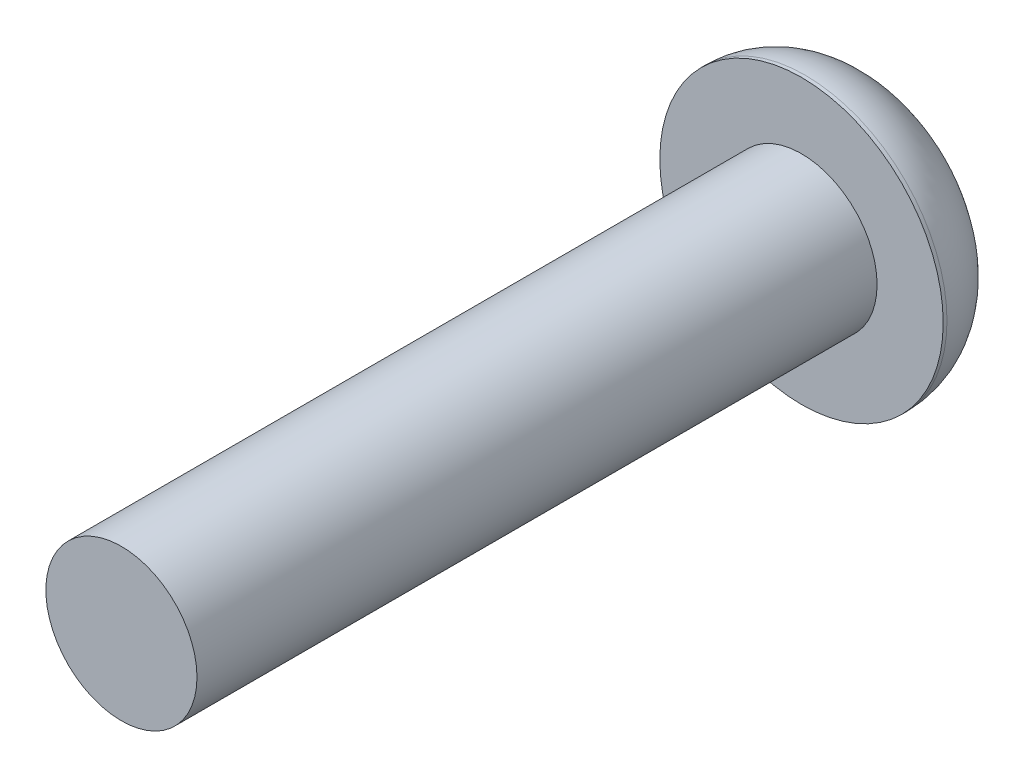
ISO-10303-21;
HEADER;
FILE_DESCRIPTION(('STEP AP214'),'2;1');
FILE_NAME('part.step','',(''),(''),'','','');
FILE_SCHEMA(('AUTOMOTIVE_DESIGN { 1 0 10303 214 1 1 1 1 }'));
ENDSEC;
DATA;
#1=APPLICATION_CONTEXT('core data for automotive mechanical design processes');
#2=APPLICATION_PROTOCOL_DEFINITION('international standard','automotive_design',2000,#1);
#3=PRODUCT_CONTEXT('',#1,'mechanical');
#4=PRODUCT('Part','Part','',(#3));
#5=PRODUCT_RELATED_PRODUCT_CATEGORY('part','',(#4));
#6=PRODUCT_DEFINITION_FORMATION('','',#4);
#7=PRODUCT_DEFINITION_CONTEXT('part definition',#1,'design');
#8=PRODUCT_DEFINITION('design','',#6,#7);
#9=PRODUCT_DEFINITION_SHAPE('','',#8);
#10=(LENGTH_UNIT() NAMED_UNIT(*) SI_UNIT(.MILLI.,.METRE.));
#11=(NAMED_UNIT(*) PLANE_ANGLE_UNIT() SI_UNIT($,.RADIAN.));
#12=(NAMED_UNIT(*) SI_UNIT($,.STERADIAN.) SOLID_ANGLE_UNIT());
#13=UNCERTAINTY_MEASURE_WITH_UNIT(LENGTH_MEASURE(1.E-05),#10,'distance_accuracy_value','');
#14=(GEOMETRIC_REPRESENTATION_CONTEXT(3) GLOBAL_UNCERTAINTY_ASSIGNED_CONTEXT((#13)) GLOBAL_UNIT_ASSIGNED_CONTEXT((#10,
#11,#12)) REPRESENTATION_CONTEXT('',''));
#15=CARTESIAN_POINT('',(0.,0.,0.));
#16=DIRECTION('',(0.,0.,1.));
#17=DIRECTION('',(1.,0.,0.));
#18=AXIS2_PLACEMENT_3D('',#15,#16,#17);
#19=CARTESIAN_POINT('',(0.,0.,18.));
#20=DIRECTION('',(0.,0.,-1.));
#21=DIRECTION('',(-1.,0.,0.));
#22=AXIS2_PLACEMENT_3D('',#19,#20,#21);
#23=CYLINDRICAL_SURFACE('',#22,2.);
#24=CARTESIAN_POINT('',(0.,0.,18.));
#25=DIRECTION('',(0.,0.,1.));
#26=DIRECTION('',(1.,0.,0.));
#27=AXIS2_PLACEMENT_3D('',#24,#25,#26);
#28=CIRCLE('',#27,2.);
#29=CARTESIAN_POINT('',(2.,0.,18.));
#30=VERTEX_POINT('',#29);
#31=EDGE_CURVE('E50',#30,#30,#28,.T.);
#32=ORIENTED_EDGE('',*,*,#31,.F.);
#33=EDGE_LOOP('',(#32));
#34=FACE_BOUND('',#33,.T.);
#35=CARTESIAN_POINT('',(0.,0.,0.));
#36=DIRECTION('',(0.,0.,1.));
#37=DIRECTION('',(1.,0.,0.));
#38=AXIS2_PLACEMENT_3D('',#35,#36,#37);
#39=CIRCLE('',#38,2.);
#40=CARTESIAN_POINT('',(2.,0.,0.));
#41=VERTEX_POINT('',#40);
#42=EDGE_CURVE('E55',#41,#41,#39,.T.);
#43=ORIENTED_EDGE('',*,*,#42,.T.);
#44=EDGE_LOOP('',(#43));
#45=FACE_BOUND('',#44,.T.);
#46=ADVANCED_FACE('F37',(#34,#45),#23,.T.);
#47=CARTESIAN_POINT('',(0.,0.,18.));
#48=DIRECTION('',(0.,0.,1.));
#49=DIRECTION('',(1.,0.,0.));
#50=AXIS2_PLACEMENT_3D('',#47,#48,#49);
#51=PLANE('',#50);
#52=ORIENTED_EDGE('',*,*,#31,.T.);
#53=EDGE_LOOP('',(#52));
#54=FACE_BOUND('',#53,.T.);
#55=ADVANCED_FACE('F82',(#54),#51,.T.);
#56=CARTESIAN_POINT('',(0.,0.,-2.1));
#57=DIRECTION('',(0.,0.,1.));
#58=DIRECTION('',(1.,0.,0.));
#59=AXIS2_PLACEMENT_3D('',#56,#57,#58);
#60=CYLINDRICAL_SURFACE('',#59,3.75);
#61=CARTESIAN_POINT('',(0.,0.,-0.1));
#62=DIRECTION('',(0.,0.,-1.));
#63=DIRECTION('',(-1.,0.,0.));
#64=AXIS2_PLACEMENT_3D('',#61,#62,#63);
#65=CIRCLE('',#64,3.75);
#66=CARTESIAN_POINT('',(-3.75,0.,-0.1));
#67=VERTEX_POINT('',#66);
#68=EDGE_CURVE('E10',#67,#67,#65,.F.);
#69=ORIENTED_EDGE('',*,*,#68,.T.);
#70=EDGE_LOOP('',(#69));
#71=FACE_BOUND('',#70,.T.);
#72=CARTESIAN_POINT('',(0.,0.,0.));
#73=DIRECTION('',(0.,0.,-1.));
#74=DIRECTION('',(-1.,0.,0.));
#75=AXIS2_PLACEMENT_3D('',#72,#73,#74);
#76=CIRCLE('',#75,3.75);
#77=CARTESIAN_POINT('',(-3.75,0.,0.));
#78=VERTEX_POINT('',#77);
#79=EDGE_CURVE('E60',#78,#78,#76,.T.);
#80=ORIENTED_EDGE('',*,*,#79,.T.);
#81=EDGE_LOOP('',(#80));
#82=FACE_BOUND('',#81,.T.);
#83=ADVANCED_FACE('F66',(#71,#82),#60,.T.);
#84=CARTESIAN_POINT('',(0.,0.,-2.1));
#85=DIRECTION('',(0.,0.,-1.));
#86=DIRECTION('',(-1.,0.,0.));
#87=AXIS2_PLACEMENT_3D('',#84,#85,#86);
#88=PLANE('',#87);
#89=CARTESIAN_POINT('',(0.,0.,-2.1));
#90=DIRECTION('',(0.,0.,-1.));
#91=DIRECTION('',(-1.,0.,0.));
#92=AXIS2_PLACEMENT_3D('',#89,#90,#91);
#93=CIRCLE('',#92,1.75);
#94=CARTESIAN_POINT('',(-1.75,0.,-2.1));
#95=VERTEX_POINT('',#94);
#96=EDGE_CURVE('E45',#95,#95,#93,.T.);
#97=ORIENTED_EDGE('',*,*,#96,.T.);
#98=EDGE_LOOP('',(#97));
#99=FACE_BOUND('',#98,.T.);
#100=ADVANCED_FACE('F70',(#99),#88,.T.);
#101=CARTESIAN_POINT('',(0.,0.,0.));
#102=DIRECTION('',(0.,0.,-1.));
#103=DIRECTION('',(-1.,0.,0.));
#104=AXIS2_PLACEMENT_3D('',#101,#102,#103);
#105=PLANE('',#104);
#106=ORIENTED_EDGE('',*,*,#42,.F.);
#107=EDGE_LOOP('',(#106));
#108=FACE_BOUND('',#107,.T.);
#109=ORIENTED_EDGE('',*,*,#79,.F.);
#110=EDGE_LOOP('',(#109));
#111=FACE_BOUND('',#110,.T.);
#112=ADVANCED_FACE('F68',(#108,#111),#105,.F.);
#113=CARTESIAN_POINT('',(0.,0.,-0.1));
#114=DIRECTION('',(0.,0.,-1.));
#115=DIRECTION('',(-1.,0.,0.));
#116=AXIS2_PLACEMENT_3D('',#113,#114,#115);
#117=DEGENERATE_TOROIDAL_SURFACE('',#116,1.75,2.,.T.);
#118=ORIENTED_EDGE('',*,*,#68,.F.);
#119=EDGE_LOOP('',(#118));
#120=FACE_BOUND('',#119,.T.);
#121=ORIENTED_EDGE('',*,*,#96,.F.);
#122=EDGE_LOOP('',(#121));
#123=FACE_BOUND('',#122,.T.);
#124=ADVANCED_FACE('F39',(#120,#123),#117,.T.);
#125=CLOSED_SHELL('',(#46,#55,#83,#100,#112,#124));
#126=MANIFOLD_SOLID_BREP('B2',#125);
#127=ADVANCED_BREP_SHAPE_REPRESENTATION('',(#18,#126),#14);
#128=SHAPE_DEFINITION_REPRESENTATION(#9,#127);
ENDSEC;
END-ISO-10303-21;
